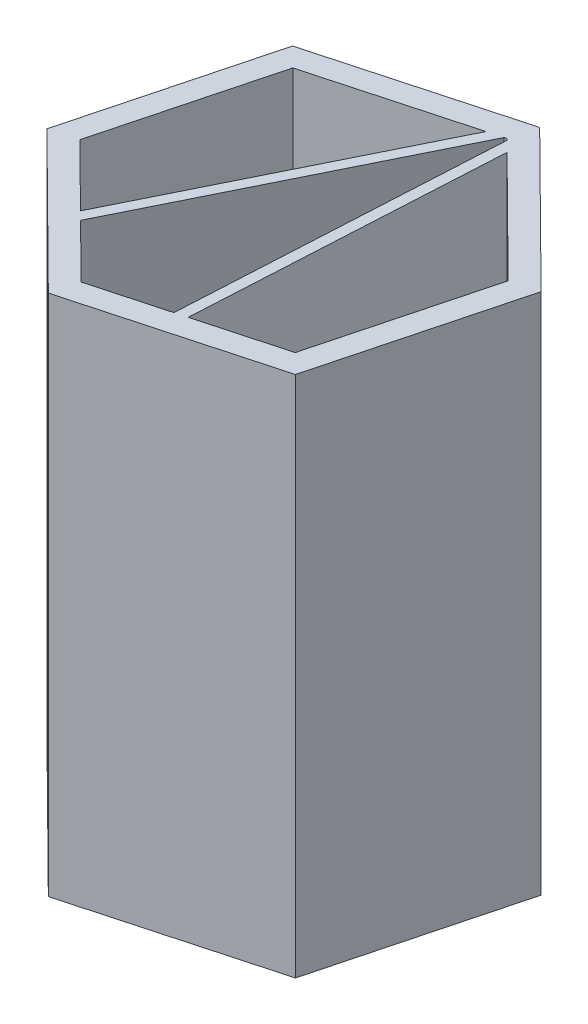
ISO-10303-21;
HEADER;
FILE_DESCRIPTION(('STEP AP214'),'2;1');
FILE_NAME('part.step','',(''),(''),'','','');
FILE_SCHEMA(('AUTOMOTIVE_DESIGN { 1 0 10303 214 1 1 1 1 }'));
ENDSEC;
DATA;
#1=APPLICATION_CONTEXT('core data for automotive mechanical design processes');
#2=APPLICATION_PROTOCOL_DEFINITION('international standard','automotive_design',2000,#1);
#3=PRODUCT_CONTEXT('',#1,'mechanical');
#4=PRODUCT('Part','Part','',(#3));
#5=PRODUCT_RELATED_PRODUCT_CATEGORY('part','',(#4));
#6=PRODUCT_DEFINITION_FORMATION('','',#4);
#7=PRODUCT_DEFINITION_CONTEXT('part definition',#1,'design');
#8=PRODUCT_DEFINITION('design','',#6,#7);
#9=PRODUCT_DEFINITION_SHAPE('','',#8);
#10=(LENGTH_UNIT() NAMED_UNIT(*) SI_UNIT(.MILLI.,.METRE.));
#11=(NAMED_UNIT(*) PLANE_ANGLE_UNIT() SI_UNIT($,.RADIAN.));
#12=(NAMED_UNIT(*) SI_UNIT($,.STERADIAN.) SOLID_ANGLE_UNIT());
#13=UNCERTAINTY_MEASURE_WITH_UNIT(LENGTH_MEASURE(1.E-05),#10,'distance_accuracy_value','');
#14=(GEOMETRIC_REPRESENTATION_CONTEXT(3) GLOBAL_UNCERTAINTY_ASSIGNED_CONTEXT((#13)) GLOBAL_UNIT_ASSIGNED_CONTEXT((#10,
#11,#12)) REPRESENTATION_CONTEXT('',''));
#15=CARTESIAN_POINT('',(0.,0.,0.));
#16=DIRECTION('',(0.,0.,1.));
#17=DIRECTION('',(1.,0.,0.));
#18=AXIS2_PLACEMENT_3D('',#15,#16,#17);
#19=CARTESIAN_POINT('',(-3.81224985483071,45.,14.5189560360818));
#20=DIRECTION('',(-0.263669614670392,0.,-0.964613048999218));
#21=DIRECTION('',(-0.964613048999218,0.,0.263669614670392));
#22=AXIS2_PLACEMENT_3D('',#19,#20,#21);
#23=PLANE('',#22);
#24=DIRECTION('',(0.,1.,0.));
#25=VECTOR('',#24,1.);
#26=CARTESIAN_POINT('',(2.46309194171588,0.,12.8036392516602));
#27=LINE('',#26,#25);
#28=CARTESIAN_POINT('',(2.46309194171588,0.,12.8036392516602));
#29=VERTEX_POINT('',#28);
#30=CARTESIAN_POINT('',(2.46309194171588,45.,12.8036392516602));
#31=VERTEX_POINT('',#30);
#32=EDGE_CURVE('E211',#29,#31,#27,.T.);
#33=ORIENTED_EDGE('',*,*,#32,.F.);
#34=DIRECTION('',(0.964613048999218,0.,-0.263669614670392));
#35=VECTOR('',#34,1.);
#36=CARTESIAN_POINT('',(-3.81224985483071,0.,14.5189560360818));
#37=LINE('',#36,#35);
#38=CARTESIAN_POINT('',(-3.81224985483071,0.,14.5189560360818));
#39=VERTEX_POINT('',#38);
#40=EDGE_CURVE('E275',#39,#29,#37,.T.);
#41=ORIENTED_EDGE('',*,*,#40,.F.);
#42=DIRECTION('',(0.,-1.,0.));
#43=VECTOR('',#42,1.);
#44=CARTESIAN_POINT('',(-3.81224985483071,45.,14.5189560360818));
#45=LINE('',#44,#43);
#46=CARTESIAN_POINT('',(-3.81224985483071,45.,14.5189560360818));
#47=VERTEX_POINT('',#46);
#48=EDGE_CURVE('E314',#47,#39,#45,.T.);
#49=ORIENTED_EDGE('',*,*,#48,.F.);
#50=DIRECTION('',(0.964613048999218,0.,-0.263669614670392));
#51=VECTOR('',#50,1.);
#52=CARTESIAN_POINT('',(-3.81224985483071,45.,14.5189560360818));
#53=LINE('',#52,#51);
#54=EDGE_CURVE('E55',#47,#31,#53,.T.);
#55=ORIENTED_EDGE('',*,*,#54,.T.);
#56=EDGE_LOOP('',(#33,#41,#49,#55));
#57=FACE_BOUND('',#56,.T.);
#58=ADVANCED_FACE('F39',(#57),#23,.T.);
#59=CARTESIAN_POINT('',(14.4799096910916,45.,-3.95797279818397));
#60=DIRECTION('',(-0.70354459792009,0.,0.710651109010223));
#61=DIRECTION('',(0.710651109010223,0.,0.70354459792009));
#62=AXIS2_PLACEMENT_3D('',#59,#60,#61);
#63=PLANE('',#62);
#64=DIRECTION('',(0.,1.,0.));
#65=VECTOR('',#64,1.);
#66=CARTESIAN_POINT('',(3.95438007663275,0.,-14.3782471164978));
#67=LINE('',#66,#65);
#68=CARTESIAN_POINT('',(3.95438007663275,0.,-14.3782471164978));
#69=VERTEX_POINT('',#68);
#70=CARTESIAN_POINT('',(3.95438007663275,45.,-14.3782471164978));
#71=VERTEX_POINT('',#70);
#72=EDGE_CURVE('E215',#69,#71,#67,.T.);
#73=ORIENTED_EDGE('',*,*,#72,.T.);
#74=DIRECTION('',(-0.710651109010223,0.,-0.70354459792009));
#75=VECTOR('',#74,1.);
#76=CARTESIAN_POINT('',(14.4799096910916,45.,-3.95797279818397));
#77=LINE('',#76,#75);
#78=CARTESIAN_POINT('',(3.8122498548307,45.,-14.5189560360818));
#79=VERTEX_POINT('',#78);
#80=EDGE_CURVE('E259',#71,#79,#77,.T.);
#81=ORIENTED_EDGE('',*,*,#80,.T.);
#82=DIRECTION('',(0.,-1.,0.));
#83=VECTOR('',#82,1.);
#84=CARTESIAN_POINT('',(3.8122498548307,45.,-14.5189560360818));
#85=LINE('',#84,#83);
#86=CARTESIAN_POINT('',(3.8122498548307,0.,-14.5189560360818));
#87=VERTEX_POINT('',#86);
#88=EDGE_CURVE('E304',#79,#87,#85,.T.);
#89=ORIENTED_EDGE('',*,*,#88,.T.);
#90=DIRECTION('',(-0.710651109010223,0.,-0.70354459792009));
#91=VECTOR('',#90,1.);
#92=CARTESIAN_POINT('',(14.4799096910916,0.,-3.95797279818397));
#93=LINE('',#92,#91);
#94=EDGE_CURVE('E283',#69,#87,#93,.T.);
#95=ORIENTED_EDGE('',*,*,#94,.F.);
#96=EDGE_LOOP('',(#73,#81,#89,#95));
#97=FACE_BOUND('',#96,.T.);
#98=ADVANCED_FACE('F418',(#97),#63,.T.);
#99=CARTESIAN_POINT('',(-14.4799096910916,45.,3.95797279818397));
#100=DIRECTION('',(0.70354459792009,0.,-0.710651109010223));
#101=DIRECTION('',(-0.710651109010223,0.,-0.70354459792009));
#102=AXIS2_PLACEMENT_3D('',#99,#100,#101);
#103=PLANE('',#102);
#104=DIRECTION('',(0.,1.,0.));
#105=VECTOR('',#104,1.);
#106=CARTESIAN_POINT('',(-9.14607977296117,0.,9.23846441713289));
#107=LINE('',#106,#105);
#108=CARTESIAN_POINT('',(-9.14607977296117,0.,9.23846441713289));
#109=VERTEX_POINT('',#108);
#110=CARTESIAN_POINT('',(-9.14607977296117,45.,9.23846441713289));
#111=VERTEX_POINT('',#110);
#112=EDGE_CURVE('E237',#109,#111,#107,.T.);
#113=ORIENTED_EDGE('',*,*,#112,.F.);
#114=DIRECTION('',(0.710651109010223,0.,0.70354459792009));
#115=VECTOR('',#114,1.);
#116=CARTESIAN_POINT('',(-14.4799096910916,0.,3.95797279818397));
#117=LINE('',#116,#115);
#118=CARTESIAN_POINT('',(-14.4799096910916,0.,3.95797279818397));
#119=VERTEX_POINT('',#118);
#120=EDGE_CURVE('E271',#119,#109,#117,.T.);
#121=ORIENTED_EDGE('',*,*,#120,.F.);
#122=DIRECTION('',(0.,-1.,0.));
#123=VECTOR('',#122,1.);
#124=CARTESIAN_POINT('',(-14.4799096910916,45.,3.95797279818397));
#125=LINE('',#124,#123);
#126=CARTESIAN_POINT('',(-14.4799096910916,45.,3.95797279818397));
#127=VERTEX_POINT('',#126);
#128=EDGE_CURVE('E270',#127,#119,#125,.T.);
#129=ORIENTED_EDGE('',*,*,#128,.F.);
#130=DIRECTION('',(0.710651109010223,0.,0.70354459792009));
#131=VECTOR('',#130,1.);
#132=CARTESIAN_POINT('',(-14.4799096910916,45.,3.95797279818397));
#133=LINE('',#132,#131);
#134=EDGE_CURVE('E188',#127,#111,#133,.T.);
#135=ORIENTED_EDGE('',*,*,#134,.T.);
#136=EDGE_LOOP('',(#113,#121,#129,#135));
#137=FACE_BOUND('',#136,.T.);
#138=ADVANCED_FACE('F414',(#137),#103,.T.);
#139=CARTESIAN_POINT('',(3.8122498548307,45.,-14.5189560360818));
#140=DIRECTION('',(0.263669614670392,0.,0.964613048999218));
#141=DIRECTION('',(0.964613048999218,0.,-0.263669614670392));
#142=AXIS2_PLACEMENT_3D('',#139,#140,#141);
#143=PLANE('',#142);
#144=DIRECTION('',(0.,1.,0.));
#145=VECTOR('',#144,1.);
#146=CARTESIAN_POINT('',(2.39607121450959,0.,-14.1318544135345));
#147=LINE('',#146,#145);
#148=CARTESIAN_POINT('',(2.39607121450958,0.,-14.1318544135345));
#149=VERTEX_POINT('',#148);
#150=CARTESIAN_POINT('',(2.39607121450959,45.,-14.1318544135345));
#151=VERTEX_POINT('',#150);
#152=EDGE_CURVE('E242',#149,#151,#147,.T.);
#153=ORIENTED_EDGE('',*,*,#152,.T.);
#154=DIRECTION('',(-0.964613048999218,0.,0.263669614670392));
#155=VECTOR('',#154,1.);
#156=CARTESIAN_POINT('',(3.8122498548307,45.,-14.5189560360818));
#157=LINE('',#156,#155);
#158=CARTESIAN_POINT('',(-10.6676598362609,45.,-10.5609832378978));
#159=VERTEX_POINT('',#158);
#160=EDGE_CURVE('E263',#151,#159,#157,.T.);
#161=ORIENTED_EDGE('',*,*,#160,.T.);
#162=DIRECTION('',(0.,-1.,0.));
#163=VECTOR('',#162,1.);
#164=CARTESIAN_POINT('',(-10.6676598362609,45.,-10.5609832378978));
#165=LINE('',#164,#163);
#166=CARTESIAN_POINT('',(-10.6676598362609,0.,-10.5609832378978));
#167=VERTEX_POINT('',#166);
#168=EDGE_CURVE('E300',#159,#167,#165,.T.);
#169=ORIENTED_EDGE('',*,*,#168,.T.);
#170=DIRECTION('',(-0.964613048999218,0.,0.263669614670392));
#171=VECTOR('',#170,1.);
#172=CARTESIAN_POINT('',(3.8122498548307,0.,-14.5189560360818));
#173=LINE('',#172,#171);
#174=EDGE_CURVE('E288',#149,#167,#173,.T.);
#175=ORIENTED_EDGE('',*,*,#174,.F.);
#176=EDGE_LOOP('',(#153,#161,#169,#175));
#177=FACE_BOUND('',#176,.T.);
#178=ADVANCED_FACE('F444',(#177),#143,.T.);
#179=CARTESIAN_POINT('',(0.,45.,0.));
#180=DIRECTION('',(0.,1.,0.));
#181=DIRECTION('',(0.,0.,1.));
#182=AXIS2_PLACEMENT_3D('',#179,#180,#181);
#183=PLANE('',#182);
#184=CARTESIAN_POINT('',(3.4277049907151,45.,12.5399696369898));
#185=VERTEX_POINT('',#184);
#186=CARTESIAN_POINT('',(10.6676598362609,45.,10.5609832378978));
#187=VERTEX_POINT('',#186);
#188=EDGE_CURVE('E179',#185,#187,#53,.T.);
#189=ORIENTED_EDGE('',*,*,#188,.F.);
#190=DIRECTION('',(0.0547809226072869,0.,-0.998498397854646));
#191=VECTOR('',#190,1.);
#192=CARTESIAN_POINT('',(3.4277049907151,45.,12.5399696369898));
#193=LINE('',#192,#191);
#194=CARTESIAN_POINT('',(4.8555790139634,45.,-13.4860601685405));
#195=VERTEX_POINT('',#194);
#196=EDGE_CURVE('E184',#185,#195,#193,.T.);
#197=ORIENTED_EDGE('',*,*,#196,.T.);
#198=CARTESIAN_POINT('',(14.4799096910916,45.,-3.95797279818397));
#199=VERTEX_POINT('',#198);
#200=EDGE_CURVE('E260',#199,#195,#77,.T.);
#201=ORIENTED_EDGE('',*,*,#200,.F.);
#202=DIRECTION('',(0.253961939988995,0.,-0.967214212590482));
#203=VECTOR('',#202,1.);
#204=CARTESIAN_POINT('',(10.6676598362609,45.,10.5609832378978));
#205=LINE('',#204,#203);
#206=EDGE_CURVE('E185',#187,#199,#205,.T.);
#207=ORIENTED_EDGE('',*,*,#206,.F.);
#208=EDGE_LOOP('',(#189,#197,#201,#207));
#209=FACE_BOUND('',#208,.T.);
#210=CARTESIAN_POINT('',(-8.43542866395094,45.,9.94200901505298));
#211=VERTEX_POINT('',#210);
#212=EDGE_CURVE('E254',#211,#47,#133,.T.);
#213=ORIENTED_EDGE('',*,*,#212,.F.);
#214=DIRECTION('',(0.442818952982873,0.,-0.896611049942589));
#215=VECTOR('',#214,1.);
#216=CARTESIAN_POINT('',(3.61932724503086,45.,-14.4662221131477));
#217=LINE('',#216,#215);
#218=CARTESIAN_POINT('',(3.61932724503086,45.,-14.4662221131477));
#219=VERTEX_POINT('',#218);
#220=EDGE_CURVE('E214',#211,#219,#217,.T.);
#221=ORIENTED_EDGE('',*,*,#220,.T.);
#222=EDGE_CURVE('E264',#79,#219,#157,.T.);
#223=ORIENTED_EDGE('',*,*,#222,.F.);
#224=ORIENTED_EDGE('',*,*,#80,.F.);
#225=DIRECTION('',(-0.054780922607287,0.,0.998498397854646));
#226=VECTOR('',#225,1.);
#227=CARTESIAN_POINT('',(3.95438007663275,45.,-14.3782471164978));
#228=LINE('',#227,#226);
#229=EDGE_CURVE('E202',#71,#31,#228,.T.);
#230=ORIENTED_EDGE('',*,*,#229,.T.);
#231=ORIENTED_EDGE('',*,*,#54,.F.);
#232=EDGE_LOOP('',(#213,#221,#223,#224,#230,#231));
#233=FACE_BOUND('',#232,.T.);
#234=DIRECTION('',(0.964613048999218,0.,-0.263669614670392));
#235=VECTOR('',#234,1.);
#236=CARTESIAN_POINT('',(-4.39874983249697,45.,16.7526415800944));
#237=LINE('',#236,#235);
#238=CARTESIAN_POINT('',(-4.39874983249697,45.,16.7526415800944));
#239=VERTEX_POINT('',#238);
#240=CARTESIAN_POINT('',(12.3088382726088,45.,12.1857498898821));
#241=VERTEX_POINT('',#240);
#242=EDGE_CURVE('E319',#239,#241,#237,.T.);
#243=ORIENTED_EDGE('',*,*,#242,.T.);
#244=DIRECTION('',(0.253961939988995,0.,-0.967214212590482));
#245=VECTOR('',#244,1.);
#246=CARTESIAN_POINT('',(12.3088382726088,45.,12.1857498898821));
#247=LINE('',#246,#245);
#248=CARTESIAN_POINT('',(16.7075881051057,45.,-4.56689169021227));
#249=VERTEX_POINT('',#248);
#250=EDGE_CURVE('E323',#241,#249,#247,.T.);
#251=ORIENTED_EDGE('',*,*,#250,.T.);
#252=DIRECTION('',(-0.710651109010223,0.,-0.70354459792009));
#253=VECTOR('',#252,1.);
#254=CARTESIAN_POINT('',(16.7075881051057,45.,-4.56689169021227));
#255=LINE('',#254,#253);
#256=CARTESIAN_POINT('',(4.39874983249698,45.,-16.7526415800944));
#257=VERTEX_POINT('',#256);
#258=EDGE_CURVE('E327',#249,#257,#255,.T.);
#259=ORIENTED_EDGE('',*,*,#258,.T.);
#260=DIRECTION('',(-0.964613048999218,0.,0.263669614670392));
#261=VECTOR('',#260,1.);
#262=CARTESIAN_POINT('',(4.39874983249698,45.,-16.7526415800944));
#263=LINE('',#262,#261);
#264=CARTESIAN_POINT('',(-12.3088382726087,45.,-12.1857498898821));
#265=VERTEX_POINT('',#264);
#266=EDGE_CURVE('E330',#257,#265,#263,.T.);
#267=ORIENTED_EDGE('',*,*,#266,.T.);
#268=DIRECTION('',(-0.253961939988995,0.,0.967214212590482));
#269=VECTOR('',#268,1.);
#270=CARTESIAN_POINT('',(-12.3088382726087,45.,-12.1857498898821));
#271=LINE('',#270,#269);
#272=CARTESIAN_POINT('',(-16.7075881051057,45.,4.56689169021228));
#273=VERTEX_POINT('',#272);
#274=EDGE_CURVE('E333',#265,#273,#271,.T.);
#275=ORIENTED_EDGE('',*,*,#274,.T.);
#276=DIRECTION('',(0.710651109010223,0.,0.70354459792009));
#277=VECTOR('',#276,1.);
#278=CARTESIAN_POINT('',(-16.7075881051057,45.,4.56689169021228));
#279=LINE('',#278,#277);
#280=EDGE_CURVE('E336',#273,#239,#279,.T.);
#281=ORIENTED_EDGE('',*,*,#280,.T.);
#282=EDGE_LOOP('',(#243,#251,#259,#267,#275,#281));
#283=FACE_BOUND('',#282,.T.);
#284=DIRECTION('',(-0.442818952982873,0.,0.896611049942589));
#285=VECTOR('',#284,1.);
#286=CARTESIAN_POINT('',(-9.14607977296117,45.,9.23846441713289));
#287=LINE('',#286,#285);
#288=EDGE_CURVE('E226',#151,#111,#287,.T.);
#289=ORIENTED_EDGE('',*,*,#288,.T.);
#290=ORIENTED_EDGE('',*,*,#134,.F.);
#291=DIRECTION('',(-0.253961939988995,0.,0.967214212590482));
#292=VECTOR('',#291,1.);
#293=CARTESIAN_POINT('',(-10.6676598362609,45.,-10.5609832378978));
#294=LINE('',#293,#292);
#295=EDGE_CURVE('E267',#159,#127,#294,.T.);
#296=ORIENTED_EDGE('',*,*,#295,.F.);
#297=ORIENTED_EDGE('',*,*,#160,.F.);
#298=EDGE_LOOP('',(#289,#290,#296,#297));
#299=FACE_BOUND('',#298,.T.);
#300=ADVANCED_FACE('F180',(#209,#233,#283,#299),#183,.T.);
#301=CARTESIAN_POINT('',(0.,0.,0.));
#302=DIRECTION('',(0.,1.,0.));
#303=DIRECTION('',(0.,0.,1.));
#304=AXIS2_PLACEMENT_3D('',#301,#302,#303);
#305=PLANE('',#304);
#306=DIRECTION('',(0.0547809226072869,0.,-0.998498397854646));
#307=VECTOR('',#306,1.);
#308=CARTESIAN_POINT('',(3.4277049907151,0.,12.5399696369898));
#309=LINE('',#308,#307);
#310=CARTESIAN_POINT('',(3.4277049907151,0.,12.5399696369898));
#311=VERTEX_POINT('',#310);
#312=CARTESIAN_POINT('',(4.8555790139634,0.,-13.4860601685405));
#313=VERTEX_POINT('',#312);
#314=EDGE_CURVE('E206',#311,#313,#309,.T.);
#315=ORIENTED_EDGE('',*,*,#314,.F.);
#316=CARTESIAN_POINT('',(10.6676598362609,0.,10.5609832378978));
#317=VERTEX_POINT('',#316);
#318=EDGE_CURVE('E63',#311,#317,#37,.T.);
#319=ORIENTED_EDGE('',*,*,#318,.T.);
#320=DIRECTION('',(0.253961939988995,0.,-0.967214212590482));
#321=VECTOR('',#320,1.);
#322=CARTESIAN_POINT('',(10.6676598362609,0.,10.5609832378978));
#323=LINE('',#322,#321);
#324=CARTESIAN_POINT('',(14.4799096910916,0.,-3.95797279818397));
#325=VERTEX_POINT('',#324);
#326=EDGE_CURVE('E279',#317,#325,#323,.T.);
#327=ORIENTED_EDGE('',*,*,#326,.T.);
#328=EDGE_CURVE('E284',#325,#313,#93,.T.);
#329=ORIENTED_EDGE('',*,*,#328,.T.);
#330=EDGE_LOOP('',(#315,#319,#327,#329));
#331=FACE_BOUND('',#330,.T.);
#332=DIRECTION('',(0.442818952982873,0.,-0.896611049942589));
#333=VECTOR('',#332,1.);
#334=CARTESIAN_POINT('',(3.61932724503086,0.,-14.4662221131477));
#335=LINE('',#334,#333);
#336=CARTESIAN_POINT('',(-8.43542866395095,0.,9.94200901505297));
#337=VERTEX_POINT('',#336);
#338=CARTESIAN_POINT('',(3.61932724503086,0.,-14.4662221131477));
#339=VERTEX_POINT('',#338);
#340=EDGE_CURVE('E221',#337,#339,#335,.T.);
#341=ORIENTED_EDGE('',*,*,#340,.F.);
#342=EDGE_CURVE('E241',#337,#39,#117,.T.);
#343=ORIENTED_EDGE('',*,*,#342,.T.);
#344=ORIENTED_EDGE('',*,*,#40,.T.);
#345=DIRECTION('',(-0.054780922607287,0.,0.998498397854646));
#346=VECTOR('',#345,1.);
#347=CARTESIAN_POINT('',(3.95438007663275,0.,-14.3782471164978));
#348=LINE('',#347,#346);
#349=EDGE_CURVE('E197',#69,#29,#348,.T.);
#350=ORIENTED_EDGE('',*,*,#349,.F.);
#351=ORIENTED_EDGE('',*,*,#94,.T.);
#352=EDGE_CURVE('E289',#87,#339,#173,.T.);
#353=ORIENTED_EDGE('',*,*,#352,.T.);
#354=EDGE_LOOP('',(#341,#343,#344,#350,#351,#353));
#355=FACE_BOUND('',#354,.T.);
#356=DIRECTION('',(0.964613048999218,0.,-0.263669614670392));
#357=VECTOR('',#356,1.);
#358=CARTESIAN_POINT('',(-4.39874983249697,0.,16.7526415800944));
#359=LINE('',#358,#357);
#360=CARTESIAN_POINT('',(-4.39874983249697,0.,16.7526415800944));
#361=VERTEX_POINT('',#360);
#362=CARTESIAN_POINT('',(12.3088382726088,0.,12.1857498898821));
#363=VERTEX_POINT('',#362);
#364=EDGE_CURVE('E318',#361,#363,#359,.T.);
#365=ORIENTED_EDGE('',*,*,#364,.F.);
#366=DIRECTION('',(0.710651109010223,0.,0.70354459792009));
#367=VECTOR('',#366,1.);
#368=CARTESIAN_POINT('',(-16.7075881051057,0.,4.56689169021228));
#369=LINE('',#368,#367);
#370=CARTESIAN_POINT('',(-16.7075881051057,0.,4.56689169021228));
#371=VERTEX_POINT('',#370);
#372=EDGE_CURVE('E324',#371,#361,#369,.T.);
#373=ORIENTED_EDGE('',*,*,#372,.F.);
#374=DIRECTION('',(-0.253961939988995,0.,0.967214212590482));
#375=VECTOR('',#374,1.);
#376=CARTESIAN_POINT('',(-12.3088382726087,0.,-12.1857498898821));
#377=LINE('',#376,#375);
#378=CARTESIAN_POINT('',(-12.3088382726087,0.,-12.1857498898821));
#379=VERTEX_POINT('',#378);
#380=EDGE_CURVE('E352',#379,#371,#377,.T.);
#381=ORIENTED_EDGE('',*,*,#380,.F.);
#382=DIRECTION('',(-0.964613048999218,0.,0.263669614670392));
#383=VECTOR('',#382,1.);
#384=CARTESIAN_POINT('',(4.39874983249698,0.,-16.7526415800944));
#385=LINE('',#384,#383);
#386=CARTESIAN_POINT('',(4.39874983249698,0.,-16.7526415800944));
#387=VERTEX_POINT('',#386);
#388=EDGE_CURVE('E349',#387,#379,#385,.T.);
#389=ORIENTED_EDGE('',*,*,#388,.F.);
#390=DIRECTION('',(-0.710651109010223,0.,-0.70354459792009));
#391=VECTOR('',#390,1.);
#392=CARTESIAN_POINT('',(16.7075881051057,0.,-4.56689169021227));
#393=LINE('',#392,#391);
#394=CARTESIAN_POINT('',(16.7075881051057,0.,-4.56689169021227));
#395=VERTEX_POINT('',#394);
#396=EDGE_CURVE('E346',#395,#387,#393,.T.);
#397=ORIENTED_EDGE('',*,*,#396,.F.);
#398=DIRECTION('',(0.253961939988995,0.,-0.967214212590482));
#399=VECTOR('',#398,1.);
#400=CARTESIAN_POINT('',(12.3088382726088,0.,12.1857498898821));
#401=LINE('',#400,#399);
#402=EDGE_CURVE('E343',#363,#395,#401,.T.);
#403=ORIENTED_EDGE('',*,*,#402,.F.);
#404=EDGE_LOOP('',(#365,#373,#381,#389,#397,#403));
#405=FACE_BOUND('',#404,.T.);
#406=ORIENTED_EDGE('',*,*,#120,.T.);
#407=DIRECTION('',(-0.442818952982873,0.,0.896611049942589));
#408=VECTOR('',#407,1.);
#409=CARTESIAN_POINT('',(-9.14607977296117,0.,9.23846441713289));
#410=LINE('',#409,#408);
#411=EDGE_CURVE('E225',#149,#109,#410,.T.);
#412=ORIENTED_EDGE('',*,*,#411,.F.);
#413=ORIENTED_EDGE('',*,*,#174,.T.);
#414=DIRECTION('',(-0.253961939988995,0.,0.967214212590482));
#415=VECTOR('',#414,1.);
#416=CARTESIAN_POINT('',(-10.6676598362609,0.,-10.5609832378978));
#417=LINE('',#416,#415);
#418=EDGE_CURVE('E293',#167,#119,#417,.T.);
#419=ORIENTED_EDGE('',*,*,#418,.T.);
#420=EDGE_LOOP('',(#406,#412,#413,#419));
#421=FACE_BOUND('',#420,.T.);
#422=ADVANCED_FACE('F383',(#331,#355,#405,#421),#305,.F.);
#423=CARTESIAN_POINT('',(-4.39874983249697,45.,16.7526415800944));
#424=DIRECTION('',(-0.263669614670392,0.,-0.964613048999218));
#425=DIRECTION('',(-0.964613048999218,0.,0.263669614670392));
#426=AXIS2_PLACEMENT_3D('',#423,#424,#425);
#427=PLANE('',#426);
#428=ORIENTED_EDGE('',*,*,#364,.T.);
#429=DIRECTION('',(0.,-1.,0.));
#430=VECTOR('',#429,1.);
#431=CARTESIAN_POINT('',(12.3088382726088,45.,12.1857498898821));
#432=LINE('',#431,#430);
#433=EDGE_CURVE('E11',#241,#363,#432,.T.);
#434=ORIENTED_EDGE('',*,*,#433,.F.);
#435=ORIENTED_EDGE('',*,*,#242,.F.);
#436=DIRECTION('',(0.,-1.,0.));
#437=VECTOR('',#436,1.);
#438=CARTESIAN_POINT('',(-4.39874983249697,45.,16.7526415800944));
#439=LINE('',#438,#437);
#440=EDGE_CURVE('E339',#239,#361,#439,.T.);
#441=ORIENTED_EDGE('',*,*,#440,.T.);
#442=EDGE_LOOP('',(#428,#434,#435,#441));
#443=FACE_BOUND('',#442,.T.);
#444=ADVANCED_FACE('F41',(#443),#427,.F.);
#445=CARTESIAN_POINT('',(12.3088382726088,45.,12.1857498898821));
#446=DIRECTION('',(-0.967214212590482,0.,-0.253961939988995));
#447=DIRECTION('',(-0.253961939988995,0.,0.967214212590482));
#448=AXIS2_PLACEMENT_3D('',#445,#446,#447);
#449=PLANE('',#448);
#450=ORIENTED_EDGE('',*,*,#402,.T.);
#451=DIRECTION('',(0.,-1.,0.));
#452=VECTOR('',#451,1.);
#453=CARTESIAN_POINT('',(16.7075881051057,45.,-4.56689169021227));
#454=LINE('',#453,#452);
#455=EDGE_CURVE('E48',#249,#395,#454,.T.);
#456=ORIENTED_EDGE('',*,*,#455,.F.);
#457=ORIENTED_EDGE('',*,*,#250,.F.);
#458=ORIENTED_EDGE('',*,*,#433,.T.);
#459=EDGE_LOOP('',(#450,#456,#457,#458));
#460=FACE_BOUND('',#459,.T.);
#461=ADVANCED_FACE('F401',(#460),#449,.F.);
#462=CARTESIAN_POINT('',(16.7075881051057,45.,-4.56689169021227));
#463=DIRECTION('',(-0.70354459792009,0.,0.710651109010223));
#464=DIRECTION('',(0.710651109010223,0.,0.70354459792009));
#465=AXIS2_PLACEMENT_3D('',#462,#463,#464);
#466=PLANE('',#465);
#467=ORIENTED_EDGE('',*,*,#396,.T.);
#468=DIRECTION('',(0.,-1.,0.));
#469=VECTOR('',#468,1.);
#470=CARTESIAN_POINT('',(4.39874983249698,45.,-16.7526415800944));
#471=LINE('',#470,#469);
#472=EDGE_CURVE('E368',#257,#387,#471,.T.);
#473=ORIENTED_EDGE('',*,*,#472,.F.);
#474=ORIENTED_EDGE('',*,*,#258,.F.);
#475=ORIENTED_EDGE('',*,*,#455,.T.);
#476=EDGE_LOOP('',(#467,#473,#474,#475));
#477=FACE_BOUND('',#476,.T.);
#478=ADVANCED_FACE('F377',(#477),#466,.F.);
#479=CARTESIAN_POINT('',(4.39874983249698,45.,-16.7526415800944));
#480=DIRECTION('',(0.263669614670392,0.,0.964613048999218));
#481=DIRECTION('',(0.964613048999218,0.,-0.263669614670392));
#482=AXIS2_PLACEMENT_3D('',#479,#480,#481);
#483=PLANE('',#482);
#484=ORIENTED_EDGE('',*,*,#388,.T.);
#485=DIRECTION('',(0.,-1.,0.));
#486=VECTOR('',#485,1.);
#487=CARTESIAN_POINT('',(-12.3088382726087,45.,-12.1857498898821));
#488=LINE('',#487,#486);
#489=EDGE_CURVE('E364',#265,#379,#488,.T.);
#490=ORIENTED_EDGE('',*,*,#489,.F.);
#491=ORIENTED_EDGE('',*,*,#266,.F.);
#492=ORIENTED_EDGE('',*,*,#472,.T.);
#493=EDGE_LOOP('',(#484,#490,#491,#492));
#494=FACE_BOUND('',#493,.T.);
#495=ADVANCED_FACE('F389',(#494),#483,.F.);
#496=CARTESIAN_POINT('',(-12.3088382726087,45.,-12.1857498898821));
#497=DIRECTION('',(0.967214212590482,0.,0.253961939988995));
#498=DIRECTION('',(0.253961939988995,0.,-0.967214212590482));
#499=AXIS2_PLACEMENT_3D('',#496,#497,#498);
#500=PLANE('',#499);
#501=ORIENTED_EDGE('',*,*,#380,.T.);
#502=DIRECTION('',(0.,-1.,0.));
#503=VECTOR('',#502,1.);
#504=CARTESIAN_POINT('',(-16.7075881051057,45.,4.56689169021228));
#505=LINE('',#504,#503);
#506=EDGE_CURVE('E360',#273,#371,#505,.T.);
#507=ORIENTED_EDGE('',*,*,#506,.F.);
#508=ORIENTED_EDGE('',*,*,#274,.F.);
#509=ORIENTED_EDGE('',*,*,#489,.T.);
#510=EDGE_LOOP('',(#501,#507,#508,#509));
#511=FACE_BOUND('',#510,.T.);
#512=ADVANCED_FACE('F393',(#511),#500,.F.);
#513=CARTESIAN_POINT('',(-16.7075881051057,45.,4.56689169021228));
#514=DIRECTION('',(0.70354459792009,0.,-0.710651109010223));
#515=DIRECTION('',(-0.710651109010223,0.,-0.70354459792009));
#516=AXIS2_PLACEMENT_3D('',#513,#514,#515);
#517=PLANE('',#516);
#518=ORIENTED_EDGE('',*,*,#372,.T.);
#519=ORIENTED_EDGE('',*,*,#440,.F.);
#520=ORIENTED_EDGE('',*,*,#280,.F.);
#521=ORIENTED_EDGE('',*,*,#506,.T.);
#522=EDGE_LOOP('',(#518,#519,#520,#521));
#523=FACE_BOUND('',#522,.T.);
#524=ADVANCED_FACE('F404',(#523),#517,.F.);
#525=DIRECTION('',(0.,1.,0.));
#526=VECTOR('',#525,1.);
#527=CARTESIAN_POINT('',(-8.43542866395094,0.,9.94200901505298));
#528=LINE('',#527,#526);
#529=EDGE_CURVE('E230',#337,#211,#528,.T.);
#530=ORIENTED_EDGE('',*,*,#529,.T.);
#531=ORIENTED_EDGE('',*,*,#212,.T.);
#532=ORIENTED_EDGE('',*,*,#48,.T.);
#533=ORIENTED_EDGE('',*,*,#342,.F.);
#534=EDGE_LOOP('',(#530,#531,#532,#533));
#535=FACE_BOUND('',#534,.T.);
#536=ADVANCED_FACE('F406',(#535),#103,.T.);
#537=DIRECTION('',(0.,1.,0.));
#538=VECTOR('',#537,1.);
#539=CARTESIAN_POINT('',(3.4277049907151,0.,12.5399696369898));
#540=LINE('',#539,#538);
#541=EDGE_CURVE('E190',#311,#185,#540,.T.);
#542=ORIENTED_EDGE('',*,*,#541,.T.);
#543=ORIENTED_EDGE('',*,*,#188,.T.);
#544=DIRECTION('',(0.,-1.,0.));
#545=VECTOR('',#544,1.);
#546=CARTESIAN_POINT('',(10.6676598362609,45.,10.5609832378978));
#547=LINE('',#546,#545);
#548=EDGE_CURVE('E311',#187,#317,#547,.T.);
#549=ORIENTED_EDGE('',*,*,#548,.T.);
#550=ORIENTED_EDGE('',*,*,#318,.F.);
#551=EDGE_LOOP('',(#542,#543,#549,#550));
#552=FACE_BOUND('',#551,.T.);
#553=ADVANCED_FACE('F191',(#552),#23,.T.);
#554=CARTESIAN_POINT('',(10.6676598362609,45.,10.5609832378978));
#555=DIRECTION('',(-0.967214212590482,0.,-0.253961939988995));
#556=DIRECTION('',(-0.253961939988995,0.,0.967214212590482));
#557=AXIS2_PLACEMENT_3D('',#554,#555,#556);
#558=PLANE('',#557);
#559=ORIENTED_EDGE('',*,*,#326,.F.);
#560=ORIENTED_EDGE('',*,*,#548,.F.);
#561=ORIENTED_EDGE('',*,*,#206,.T.);
#562=DIRECTION('',(0.,-1.,0.));
#563=VECTOR('',#562,1.);
#564=CARTESIAN_POINT('',(14.4799096910916,45.,-3.95797279818397));
#565=LINE('',#564,#563);
#566=EDGE_CURVE('E308',#199,#325,#565,.T.);
#567=ORIENTED_EDGE('',*,*,#566,.T.);
#568=EDGE_LOOP('',(#559,#560,#561,#567));
#569=FACE_BOUND('',#568,.T.);
#570=ADVANCED_FACE('F428',(#569),#558,.T.);
#571=DIRECTION('',(0.,1.,0.));
#572=VECTOR('',#571,1.);
#573=CARTESIAN_POINT('',(4.8555790139634,0.,-13.4860601685405));
#574=LINE('',#573,#572);
#575=EDGE_CURVE('E196',#313,#195,#574,.T.);
#576=ORIENTED_EDGE('',*,*,#575,.F.);
#577=ORIENTED_EDGE('',*,*,#328,.F.);
#578=ORIENTED_EDGE('',*,*,#566,.F.);
#579=ORIENTED_EDGE('',*,*,#200,.T.);
#580=EDGE_LOOP('',(#576,#577,#578,#579));
#581=FACE_BOUND('',#580,.T.);
#582=ADVANCED_FACE('F425',(#581),#63,.T.);
#583=DIRECTION('',(0.,1.,0.));
#584=VECTOR('',#583,1.);
#585=CARTESIAN_POINT('',(3.61932724503086,0.,-14.4662221131477));
#586=LINE('',#585,#584);
#587=EDGE_CURVE('E246',#339,#219,#586,.T.);
#588=ORIENTED_EDGE('',*,*,#587,.F.);
#589=ORIENTED_EDGE('',*,*,#352,.F.);
#590=ORIENTED_EDGE('',*,*,#88,.F.);
#591=ORIENTED_EDGE('',*,*,#222,.T.);
#592=EDGE_LOOP('',(#588,#589,#590,#591));
#593=FACE_BOUND('',#592,.T.);
#594=ADVANCED_FACE('F436',(#593),#143,.T.);
#595=CARTESIAN_POINT('',(-10.6676598362609,45.,-10.5609832378978));
#596=DIRECTION('',(0.967214212590482,0.,0.253961939988995));
#597=DIRECTION('',(0.253961939988995,0.,-0.967214212590482));
#598=AXIS2_PLACEMENT_3D('',#595,#596,#597);
#599=PLANE('',#598);
#600=ORIENTED_EDGE('',*,*,#418,.F.);
#601=ORIENTED_EDGE('',*,*,#168,.F.);
#602=ORIENTED_EDGE('',*,*,#295,.T.);
#603=ORIENTED_EDGE('',*,*,#128,.T.);
#604=EDGE_LOOP('',(#600,#601,#602,#603));
#605=FACE_BOUND('',#604,.T.);
#606=ADVANCED_FACE('F442',(#605),#599,.T.);
#607=CARTESIAN_POINT('',(-9.14607977296117,0.,9.23846441713289));
#608=DIRECTION('',(-0.896611049942589,0.,-0.442818952982873));
#609=DIRECTION('',(-0.442818952982873,0.,0.896611049942589));
#610=AXIS2_PLACEMENT_3D('',#607,#608,#609);
#611=PLANE('',#610);
#612=ORIENTED_EDGE('',*,*,#288,.F.);
#613=ORIENTED_EDGE('',*,*,#152,.F.);
#614=ORIENTED_EDGE('',*,*,#411,.T.);
#615=ORIENTED_EDGE('',*,*,#112,.T.);
#616=EDGE_LOOP('',(#612,#613,#614,#615));
#617=FACE_BOUND('',#616,.T.);
#618=ADVANCED_FACE('F447',(#617),#611,.T.);
#619=CARTESIAN_POINT('',(3.61932724503086,0.,-14.4662221131477));
#620=DIRECTION('',(0.896611049942589,0.,0.442818952982873));
#621=DIRECTION('',(0.442818952982873,0.,-0.896611049942589));
#622=AXIS2_PLACEMENT_3D('',#619,#620,#621);
#623=PLANE('',#622);
#624=ORIENTED_EDGE('',*,*,#220,.F.);
#625=ORIENTED_EDGE('',*,*,#529,.F.);
#626=ORIENTED_EDGE('',*,*,#340,.T.);
#627=ORIENTED_EDGE('',*,*,#587,.T.);
#628=EDGE_LOOP('',(#624,#625,#626,#627));
#629=FACE_BOUND('',#628,.T.);
#630=ADVANCED_FACE('F449',(#629),#623,.T.);
#631=CARTESIAN_POINT('',(3.95438007663275,0.,-14.3782471164978));
#632=DIRECTION('',(-0.998498397854646,0.,-0.054780922607287));
#633=DIRECTION('',(-0.054780922607287,0.,0.998498397854646));
#634=AXIS2_PLACEMENT_3D('',#631,#632,#633);
#635=PLANE('',#634);
#636=ORIENTED_EDGE('',*,*,#229,.F.);
#637=ORIENTED_EDGE('',*,*,#72,.F.);
#638=ORIENTED_EDGE('',*,*,#349,.T.);
#639=ORIENTED_EDGE('',*,*,#32,.T.);
#640=EDGE_LOOP('',(#636,#637,#638,#639));
#641=FACE_BOUND('',#640,.T.);
#642=ADVANCED_FACE('F452',(#641),#635,.T.);
#643=CARTESIAN_POINT('',(3.4277049907151,0.,12.5399696369898));
#644=DIRECTION('',(0.998498397854646,0.,0.0547809226072869));
#645=DIRECTION('',(0.0547809226072869,0.,-0.998498397854646));
#646=AXIS2_PLACEMENT_3D('',#643,#644,#645);
#647=PLANE('',#646);
#648=ORIENTED_EDGE('',*,*,#196,.F.);
#649=ORIENTED_EDGE('',*,*,#541,.F.);
#650=ORIENTED_EDGE('',*,*,#314,.T.);
#651=ORIENTED_EDGE('',*,*,#575,.T.);
#652=EDGE_LOOP('',(#648,#649,#650,#651));
#653=FACE_BOUND('',#652,.T.);
#654=ADVANCED_FACE('F200',(#653),#647,.T.);
#655=CLOSED_SHELL('',(#58,#98,#138,#178,#300,#422,#444,#461,#478,#495,#512,#524,#536,#553,#570,
#582,#594,#606,#618,#630,#642,#654));
#656=MANIFOLD_SOLID_BREP('B2',#655);
#657=ADVANCED_BREP_SHAPE_REPRESENTATION('',(#18,#656),#14);
#658=SHAPE_DEFINITION_REPRESENTATION(#9,#657);
ENDSEC;
END-ISO-10303-21;
